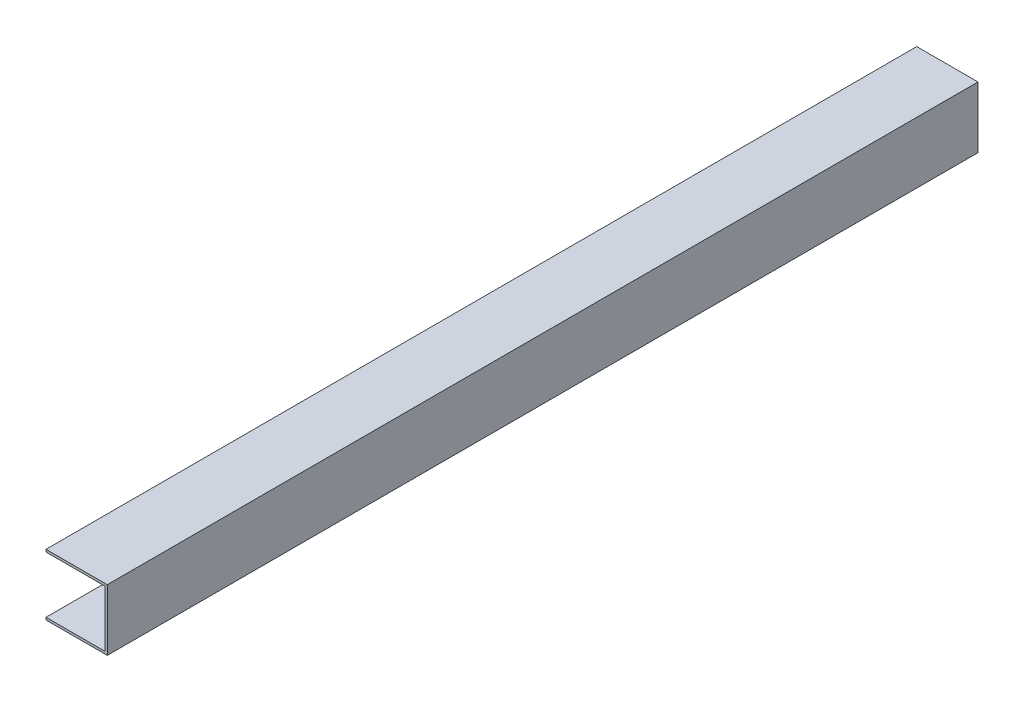
ISO-10303-21;
HEADER;
FILE_DESCRIPTION(('STEP AP214'),'2;1');
FILE_NAME('part.step','',(''),(''),'','','');
FILE_SCHEMA(('AUTOMOTIVE_DESIGN { 1 0 10303 214 1 1 1 1 }'));
ENDSEC;
DATA;
#1=APPLICATION_CONTEXT('core data for automotive mechanical design processes');
#2=APPLICATION_PROTOCOL_DEFINITION('international standard','automotive_design',2000,#1);
#3=PRODUCT_CONTEXT('',#1,'mechanical');
#4=PRODUCT('Part','Part','',(#3));
#5=PRODUCT_RELATED_PRODUCT_CATEGORY('part','',(#4));
#6=PRODUCT_DEFINITION_FORMATION('','',#4);
#7=PRODUCT_DEFINITION_CONTEXT('part definition',#1,'design');
#8=PRODUCT_DEFINITION('design','',#6,#7);
#9=PRODUCT_DEFINITION_SHAPE('','',#8);
#10=(LENGTH_UNIT() NAMED_UNIT(*) SI_UNIT(.MILLI.,.METRE.));
#11=(NAMED_UNIT(*) PLANE_ANGLE_UNIT() SI_UNIT($,.RADIAN.));
#12=(NAMED_UNIT(*) SI_UNIT($,.STERADIAN.) SOLID_ANGLE_UNIT());
#13=UNCERTAINTY_MEASURE_WITH_UNIT(LENGTH_MEASURE(1.E-05),#10,'distance_accuracy_value','');
#14=(GEOMETRIC_REPRESENTATION_CONTEXT(3) GLOBAL_UNCERTAINTY_ASSIGNED_CONTEXT((#13)) GLOBAL_UNIT_ASSIGNED_CONTEXT((#10,
#11,#12)) REPRESENTATION_CONTEXT('',''));
#15=CARTESIAN_POINT('',(0.,0.,0.));
#16=DIRECTION('',(0.,0.,1.));
#17=DIRECTION('',(1.,0.,0.));
#18=AXIS2_PLACEMENT_3D('',#15,#16,#17);
#19=CARTESIAN_POINT('',(0.,0.,361.));
#20=DIRECTION('',(0.,0.,-1.));
#21=DIRECTION('',(-1.,0.,0.));
#22=AXIS2_PLACEMENT_3D('',#19,#20,#21);
#23=PLANE('',#22);
#24=DIRECTION('',(1.,0.,0.));
#25=VECTOR('',#24,1.);
#26=CARTESIAN_POINT('',(-1.,-24.4,361.));
#27=LINE('',#26,#25);
#28=CARTESIAN_POINT('',(-25.4,-24.4,361.));
#29=VERTEX_POINT('',#28);
#30=CARTESIAN_POINT('',(-1.,-24.4,361.));
#31=VERTEX_POINT('',#30);
#32=EDGE_CURVE('E223',#29,#31,#27,.T.);
#33=ORIENTED_EDGE('',*,*,#32,.F.);
#34=DIRECTION('',(0.,-1.,0.));
#35=VECTOR('',#34,1.);
#36=CARTESIAN_POINT('',(-25.4,0.,361.));
#37=LINE('',#36,#35);
#38=CARTESIAN_POINT('',(-25.4,-25.4,361.));
#39=VERTEX_POINT('',#38);
#40=EDGE_CURVE('E179',#29,#39,#37,.T.);
#41=ORIENTED_EDGE('',*,*,#40,.T.);
#42=DIRECTION('',(1.,0.,0.));
#43=VECTOR('',#42,1.);
#44=CARTESIAN_POINT('',(0.,-25.4,361.));
#45=LINE('',#44,#43);
#46=CARTESIAN_POINT('',(0.,-25.4,361.));
#47=VERTEX_POINT('',#46);
#48=EDGE_CURVE('E65',#39,#47,#45,.T.);
#49=ORIENTED_EDGE('',*,*,#48,.T.);
#50=DIRECTION('',(0.,1.,0.));
#51=VECTOR('',#50,1.);
#52=CARTESIAN_POINT('',(0.,0.,361.));
#53=LINE('',#52,#51);
#54=CARTESIAN_POINT('',(0.,0.,361.));
#55=VERTEX_POINT('',#54);
#56=EDGE_CURVE('E176',#47,#55,#53,.T.);
#57=ORIENTED_EDGE('',*,*,#56,.T.);
#58=DIRECTION('',(-1.,0.,0.));
#59=VECTOR('',#58,1.);
#60=CARTESIAN_POINT('',(0.,0.,361.));
#61=LINE('',#60,#59);
#62=CARTESIAN_POINT('',(-25.4,0.,361.));
#63=VERTEX_POINT('',#62);
#64=EDGE_CURVE('E93',#55,#63,#61,.T.);
#65=ORIENTED_EDGE('',*,*,#64,.T.);
#66=CARTESIAN_POINT('',(-25.4,-1.,361.));
#67=VERTEX_POINT('',#66);
#68=EDGE_CURVE('E180',#63,#67,#37,.T.);
#69=ORIENTED_EDGE('',*,*,#68,.T.);
#70=DIRECTION('',(-1.,0.,0.));
#71=VECTOR('',#70,1.);
#72=CARTESIAN_POINT('',(-1.,-1.,361.));
#73=LINE('',#72,#71);
#74=CARTESIAN_POINT('',(-1.,-1.,361.));
#75=VERTEX_POINT('',#74);
#76=EDGE_CURVE('E221',#75,#67,#73,.T.);
#77=ORIENTED_EDGE('',*,*,#76,.F.);
#78=DIRECTION('',(0.,1.,0.));
#79=VECTOR('',#78,1.);
#80=CARTESIAN_POINT('',(-1.,-1.,361.));
#81=LINE('',#80,#79);
#82=EDGE_CURVE('E219',#31,#75,#81,.T.);
#83=ORIENTED_EDGE('',*,*,#82,.F.);
#84=EDGE_LOOP('',(#33,#41,#49,#57,#65,#69,#77,#83));
#85=FACE_BOUND('',#84,.T.);
#86=ADVANCED_FACE('F41',(#85),#23,.F.);
#87=CARTESIAN_POINT('',(0.,0.,0.));
#88=DIRECTION('',(0.,0.,-1.));
#89=DIRECTION('',(-1.,0.,0.));
#90=AXIS2_PLACEMENT_3D('',#87,#88,#89);
#91=PLANE('',#90);
#92=DIRECTION('',(-1.,0.,0.));
#93=VECTOR('',#92,1.);
#94=CARTESIAN_POINT('',(-1.,-1.,0.));
#95=LINE('',#94,#93);
#96=CARTESIAN_POINT('',(-1.,-1.,0.));
#97=VERTEX_POINT('',#96);
#98=CARTESIAN_POINT('',(-25.4,-1.,0.));
#99=VERTEX_POINT('',#98);
#100=EDGE_CURVE('E205',#97,#99,#95,.T.);
#101=ORIENTED_EDGE('',*,*,#100,.T.);
#102=DIRECTION('',(0.,-1.,0.));
#103=VECTOR('',#102,1.);
#104=CARTESIAN_POINT('',(-25.4,0.,0.));
#105=LINE('',#104,#103);
#106=CARTESIAN_POINT('',(-25.4,0.,0.));
#107=VERTEX_POINT('',#106);
#108=EDGE_CURVE('E190',#107,#99,#105,.T.);
#109=ORIENTED_EDGE('',*,*,#108,.F.);
#110=DIRECTION('',(-1.,0.,0.));
#111=VECTOR('',#110,1.);
#112=CARTESIAN_POINT('',(0.,0.,0.));
#113=LINE('',#112,#111);
#114=CARTESIAN_POINT('',(0.,0.,0.));
#115=VERTEX_POINT('',#114);
#116=EDGE_CURVE('E187',#115,#107,#113,.T.);
#117=ORIENTED_EDGE('',*,*,#116,.F.);
#118=DIRECTION('',(0.,1.,0.));
#119=VECTOR('',#118,1.);
#120=CARTESIAN_POINT('',(0.,0.,0.));
#121=LINE('',#120,#119);
#122=CARTESIAN_POINT('',(0.,-25.4,0.));
#123=VERTEX_POINT('',#122);
#124=EDGE_CURVE('E170',#123,#115,#121,.T.);
#125=ORIENTED_EDGE('',*,*,#124,.F.);
#126=DIRECTION('',(1.,0.,0.));
#127=VECTOR('',#126,1.);
#128=CARTESIAN_POINT('',(0.,-25.4,0.));
#129=LINE('',#128,#127);
#130=CARTESIAN_POINT('',(-25.4,-25.4,0.));
#131=VERTEX_POINT('',#130);
#132=EDGE_CURVE('E86',#131,#123,#129,.T.);
#133=ORIENTED_EDGE('',*,*,#132,.F.);
#134=CARTESIAN_POINT('',(-25.4,-24.4,0.));
#135=VERTEX_POINT('',#134);
#136=EDGE_CURVE('E189',#135,#131,#105,.T.);
#137=ORIENTED_EDGE('',*,*,#136,.F.);
#138=DIRECTION('',(1.,0.,0.));
#139=VECTOR('',#138,1.);
#140=CARTESIAN_POINT('',(-1.,-24.4,0.));
#141=LINE('',#140,#139);
#142=CARTESIAN_POINT('',(-1.,-24.4,0.));
#143=VERTEX_POINT('',#142);
#144=EDGE_CURVE('E208',#135,#143,#141,.T.);
#145=ORIENTED_EDGE('',*,*,#144,.T.);
#146=DIRECTION('',(0.,1.,0.));
#147=VECTOR('',#146,1.);
#148=CARTESIAN_POINT('',(-1.,-1.,0.));
#149=LINE('',#148,#147);
#150=EDGE_CURVE('E56',#143,#97,#149,.T.);
#151=ORIENTED_EDGE('',*,*,#150,.T.);
#152=EDGE_LOOP('',(#101,#109,#117,#125,#133,#137,#145,#151));
#153=FACE_BOUND('',#152,.T.);
#154=ADVANCED_FACE('F203',(#153),#91,.T.);
#155=CARTESIAN_POINT('',(0.,0.,361.));
#156=DIRECTION('',(-1.,0.,0.));
#157=DIRECTION('',(0.,-1.,0.));
#158=AXIS2_PLACEMENT_3D('',#155,#156,#157);
#159=PLANE('',#158);
#160=ORIENTED_EDGE('',*,*,#124,.T.);
#161=DIRECTION('',(0.,0.,-1.));
#162=VECTOR('',#161,1.);
#163=CARTESIAN_POINT('',(0.,0.,361.));
#164=LINE('',#163,#162);
#165=EDGE_CURVE('E11',#55,#115,#164,.T.);
#166=ORIENTED_EDGE('',*,*,#165,.F.);
#167=ORIENTED_EDGE('',*,*,#56,.F.);
#168=DIRECTION('',(0.,0.,-1.));
#169=VECTOR('',#168,1.);
#170=CARTESIAN_POINT('',(0.,-25.4,361.));
#171=LINE('',#170,#169);
#172=EDGE_CURVE('E184',#47,#123,#171,.T.);
#173=ORIENTED_EDGE('',*,*,#172,.T.);
#174=EDGE_LOOP('',(#160,#166,#167,#173));
#175=FACE_BOUND('',#174,.T.);
#176=ADVANCED_FACE('F43',(#175),#159,.F.);
#177=CARTESIAN_POINT('',(0.,0.,361.));
#178=DIRECTION('',(0.,-1.,0.));
#179=DIRECTION('',(0.,0.,-1.));
#180=AXIS2_PLACEMENT_3D('',#177,#178,#179);
#181=PLANE('',#180);
#182=ORIENTED_EDGE('',*,*,#116,.T.);
#183=DIRECTION('',(0.,0.,-1.));
#184=VECTOR('',#183,1.);
#185=CARTESIAN_POINT('',(-25.4,0.,361.));
#186=LINE('',#185,#184);
#187=EDGE_CURVE('E49',#63,#107,#186,.T.);
#188=ORIENTED_EDGE('',*,*,#187,.F.);
#189=ORIENTED_EDGE('',*,*,#64,.F.);
#190=ORIENTED_EDGE('',*,*,#165,.T.);
#191=EDGE_LOOP('',(#182,#188,#189,#190));
#192=FACE_BOUND('',#191,.T.);
#193=ADVANCED_FACE('F273',(#192),#181,.F.);
#194=CARTESIAN_POINT('',(-25.4,0.,361.));
#195=DIRECTION('',(1.,0.,0.));
#196=DIRECTION('',(0.,1.,0.));
#197=AXIS2_PLACEMENT_3D('',#194,#195,#196);
#198=PLANE('',#197);
#199=DIRECTION('',(0.,1.,0.));
#200=VECTOR('',#199,1.);
#201=CARTESIAN_POINT('',(-25.4,-24.4,61.));
#202=LINE('',#201,#200);
#203=CARTESIAN_POINT('',(-25.4,-24.4,61.));
#204=VERTEX_POINT('',#203);
#205=CARTESIAN_POINT('',(-25.4,-1.,61.));
#206=VERTEX_POINT('',#205);
#207=EDGE_CURVE('E148',#204,#206,#202,.T.);
#208=ORIENTED_EDGE('',*,*,#207,.F.);
#209=DIRECTION('',(0.,0.,1.));
#210=VECTOR('',#209,1.);
#211=CARTESIAN_POINT('',(-25.4,-24.4,0.));
#212=LINE('',#211,#210);
#213=EDGE_CURVE('E152',#135,#204,#212,.T.);
#214=ORIENTED_EDGE('',*,*,#213,.F.);
#215=ORIENTED_EDGE('',*,*,#136,.T.);
#216=DIRECTION('',(0.,0.,-1.));
#217=VECTOR('',#216,1.);
#218=CARTESIAN_POINT('',(-25.4,-25.4,361.));
#219=LINE('',#218,#217);
#220=EDGE_CURVE('E195',#39,#131,#219,.T.);
#221=ORIENTED_EDGE('',*,*,#220,.F.);
#222=ORIENTED_EDGE('',*,*,#40,.F.);
#223=DIRECTION('',(0.,0.,1.));
#224=VECTOR('',#223,1.);
#225=CARTESIAN_POINT('',(-25.4,-24.4,361.));
#226=LINE('',#225,#224);
#227=CARTESIAN_POINT('',(-25.4,-24.4,311.));
#228=VERTEX_POINT('',#227);
#229=EDGE_CURVE('E242',#228,#29,#226,.T.);
#230=ORIENTED_EDGE('',*,*,#229,.F.);
#231=DIRECTION('',(0.,-1.,0.));
#232=VECTOR('',#231,1.);
#233=CARTESIAN_POINT('',(-25.4,-1.,311.));
#234=LINE('',#233,#232);
#235=CARTESIAN_POINT('',(-25.4,-1.,311.));
#236=VERTEX_POINT('',#235);
#237=EDGE_CURVE('E213',#236,#228,#234,.T.);
#238=ORIENTED_EDGE('',*,*,#237,.F.);
#239=DIRECTION('',(0.,0.,-1.));
#240=VECTOR('',#239,1.);
#241=CARTESIAN_POINT('',(-25.4,-1.,361.));
#242=LINE('',#241,#240);
#243=EDGE_CURVE('E211',#67,#236,#242,.T.);
#244=ORIENTED_EDGE('',*,*,#243,.F.);
#245=ORIENTED_EDGE('',*,*,#68,.F.);
#246=ORIENTED_EDGE('',*,*,#187,.T.);
#247=ORIENTED_EDGE('',*,*,#108,.T.);
#248=DIRECTION('',(0.,0.,-1.));
#249=VECTOR('',#248,1.);
#250=CARTESIAN_POINT('',(-25.4,-1.,0.));
#251=LINE('',#250,#249);
#252=EDGE_CURVE('E210',#206,#99,#251,.T.);
#253=ORIENTED_EDGE('',*,*,#252,.F.);
#254=EDGE_LOOP('',(#208,#214,#215,#221,#222,#230,#238,#244,#245,#246,#247,#253));
#255=FACE_BOUND('',#254,.T.);
#256=ADVANCED_FACE('F200',(#255),#198,.F.);
#257=CARTESIAN_POINT('',(0.,-25.4,361.));
#258=DIRECTION('',(0.,1.,0.));
#259=DIRECTION('',(-1.,0.,0.));
#260=AXIS2_PLACEMENT_3D('',#257,#258,#259);
#261=PLANE('',#260);
#262=ORIENTED_EDGE('',*,*,#132,.T.);
#263=ORIENTED_EDGE('',*,*,#172,.F.);
#264=ORIENTED_EDGE('',*,*,#48,.F.);
#265=ORIENTED_EDGE('',*,*,#220,.T.);
#266=EDGE_LOOP('',(#262,#263,#264,#265));
#267=FACE_BOUND('',#266,.T.);
#268=ADVANCED_FACE('F234',(#267),#261,.F.);
#269=CARTESIAN_POINT('',(-1.,-1.,361.));
#270=DIRECTION('',(-1.,0.,0.));
#271=DIRECTION('',(0.,0.,1.));
#272=AXIS2_PLACEMENT_3D('',#269,#270,#271);
#273=PLANE('',#272);
#274=ORIENTED_EDGE('',*,*,#150,.F.);
#275=DIRECTION('',(0.,0.,-1.));
#276=VECTOR('',#275,1.);
#277=CARTESIAN_POINT('',(-1.,-24.4,361.));
#278=LINE('',#277,#276);
#279=EDGE_CURVE('E172',#31,#143,#278,.T.);
#280=ORIENTED_EDGE('',*,*,#279,.F.);
#281=ORIENTED_EDGE('',*,*,#82,.T.);
#282=DIRECTION('',(0.,0.,-1.));
#283=VECTOR('',#282,1.);
#284=CARTESIAN_POINT('',(-1.,-1.,361.));
#285=LINE('',#284,#283);
#286=EDGE_CURVE('E168',#75,#97,#285,.T.);
#287=ORIENTED_EDGE('',*,*,#286,.T.);
#288=EDGE_LOOP('',(#274,#280,#281,#287));
#289=FACE_BOUND('',#288,.T.);
#290=ADVANCED_FACE('F267',(#289),#273,.T.);
#291=CARTESIAN_POINT('',(-1.,-1.,361.));
#292=DIRECTION('',(0.,-1.,0.));
#293=DIRECTION('',(0.,0.,-1.));
#294=AXIS2_PLACEMENT_3D('',#291,#292,#293);
#295=PLANE('',#294);
#296=ORIENTED_EDGE('',*,*,#100,.F.);
#297=ORIENTED_EDGE('',*,*,#286,.F.);
#298=ORIENTED_EDGE('',*,*,#76,.T.);
#299=ORIENTED_EDGE('',*,*,#243,.T.);
#300=DIRECTION('',(-1.,0.,0.));
#301=VECTOR('',#300,1.);
#302=CARTESIAN_POINT('',(30.8047099439894,-0.999999999999993,311.));
#303=LINE('',#302,#301);
#304=CARTESIAN_POINT('',(-24.4,-0.999999999999993,311.));
#305=VERTEX_POINT('',#304);
#306=EDGE_CURVE('E167',#305,#236,#303,.T.);
#307=ORIENTED_EDGE('',*,*,#306,.F.);
#308=DIRECTION('',(0.,0.,-1.));
#309=VECTOR('',#308,1.);
#310=CARTESIAN_POINT('',(-24.4,-1.,361.));
#311=LINE('',#310,#309);
#312=CARTESIAN_POINT('',(-24.4,-1.,61.));
#313=VERTEX_POINT('',#312);
#314=EDGE_CURVE('E160',#305,#313,#311,.T.);
#315=ORIENTED_EDGE('',*,*,#314,.T.);
#316=DIRECTION('',(-1.,0.,0.));
#317=VECTOR('',#316,1.);
#318=CARTESIAN_POINT('',(0.00100000000000447,-0.999999999999997,61.));
#319=LINE('',#318,#317);
#320=EDGE_CURVE('E141',#313,#206,#319,.T.);
#321=ORIENTED_EDGE('',*,*,#320,.T.);
#322=ORIENTED_EDGE('',*,*,#252,.T.);
#323=EDGE_LOOP('',(#296,#297,#298,#299,#307,#315,#321,#322));
#324=FACE_BOUND('',#323,.T.);
#325=ADVANCED_FACE('F165',(#324),#295,.T.);
#326=CARTESIAN_POINT('',(-24.4,-1.,361.));
#327=DIRECTION('',(1.,0.,0.));
#328=DIRECTION('',(0.,0.,-1.));
#329=AXIS2_PLACEMENT_3D('',#326,#327,#328);
#330=PLANE('',#329);
#331=DIRECTION('',(0.,1.,0.));
#332=VECTOR('',#331,1.);
#333=CARTESIAN_POINT('',(-24.4,-24.4,61.));
#334=LINE('',#333,#332);
#335=CARTESIAN_POINT('',(-24.4,-24.4,61.));
#336=VERTEX_POINT('',#335);
#337=EDGE_CURVE('E145',#336,#313,#334,.T.);
#338=ORIENTED_EDGE('',*,*,#337,.T.);
#339=ORIENTED_EDGE('',*,*,#314,.F.);
#340=DIRECTION('',(0.,-1.,0.));
#341=VECTOR('',#340,1.);
#342=CARTESIAN_POINT('',(-24.4,-0.999999999999993,311.));
#343=LINE('',#342,#341);
#344=CARTESIAN_POINT('',(-24.4,-24.4,311.));
#345=VERTEX_POINT('',#344);
#346=EDGE_CURVE('E245',#305,#345,#343,.T.);
#347=ORIENTED_EDGE('',*,*,#346,.T.);
#348=DIRECTION('',(0.,0.,-1.));
#349=VECTOR('',#348,1.);
#350=CARTESIAN_POINT('',(-24.4,-24.4,361.));
#351=LINE('',#350,#349);
#352=EDGE_CURVE('E162',#345,#336,#351,.T.);
#353=ORIENTED_EDGE('',*,*,#352,.T.);
#354=EDGE_LOOP('',(#338,#339,#347,#353));
#355=FACE_BOUND('',#354,.T.);
#356=ADVANCED_FACE('F158',(#355),#330,.T.);
#357=CARTESIAN_POINT('',(-1.,-24.4,361.));
#358=DIRECTION('',(0.,1.,0.));
#359=DIRECTION('',(-1.,0.,0.));
#360=AXIS2_PLACEMENT_3D('',#357,#358,#359);
#361=PLANE('',#360);
#362=ORIENTED_EDGE('',*,*,#144,.F.);
#363=ORIENTED_EDGE('',*,*,#213,.T.);
#364=DIRECTION('',(-1.,0.,0.));
#365=VECTOR('',#364,1.);
#366=CARTESIAN_POINT('',(0.00100000000000794,-24.4,61.));
#367=LINE('',#366,#365);
#368=EDGE_CURVE('E153',#336,#204,#367,.T.);
#369=ORIENTED_EDGE('',*,*,#368,.F.);
#370=ORIENTED_EDGE('',*,*,#352,.F.);
#371=DIRECTION('',(-1.,0.,0.));
#372=VECTOR('',#371,1.);
#373=CARTESIAN_POINT('',(30.8047099439894,-24.4,311.));
#374=LINE('',#373,#372);
#375=EDGE_CURVE('E249',#345,#228,#374,.T.);
#376=ORIENTED_EDGE('',*,*,#375,.T.);
#377=ORIENTED_EDGE('',*,*,#229,.T.);
#378=ORIENTED_EDGE('',*,*,#32,.T.);
#379=ORIENTED_EDGE('',*,*,#279,.T.);
#380=EDGE_LOOP('',(#362,#363,#369,#370,#376,#377,#378,#379));
#381=FACE_BOUND('',#380,.T.);
#382=ADVANCED_FACE('F227',(#381),#361,.T.);
#383=CARTESIAN_POINT('',(30.8047099439894,-0.999999999999993,311.));
#384=DIRECTION('',(0.,0.,-1.));
#385=DIRECTION('',(-1.,0.,0.));
#386=AXIS2_PLACEMENT_3D('',#383,#384,#385);
#387=PLANE('',#386);
#388=ORIENTED_EDGE('',*,*,#306,.T.);
#389=ORIENTED_EDGE('',*,*,#237,.T.);
#390=ORIENTED_EDGE('',*,*,#375,.F.);
#391=ORIENTED_EDGE('',*,*,#346,.F.);
#392=EDGE_LOOP('',(#388,#389,#390,#391));
#393=FACE_BOUND('',#392,.T.);
#394=ADVANCED_FACE('F250',(#393),#387,.F.);
#395=CARTESIAN_POINT('',(0.00100000000000794,-24.4,61.));
#396=DIRECTION('',(0.,0.,1.));
#397=DIRECTION('',(1.,0.,0.));
#398=AXIS2_PLACEMENT_3D('',#395,#396,#397);
#399=PLANE('',#398);
#400=ORIENTED_EDGE('',*,*,#368,.T.);
#401=ORIENTED_EDGE('',*,*,#207,.T.);
#402=ORIENTED_EDGE('',*,*,#320,.F.);
#403=ORIENTED_EDGE('',*,*,#337,.F.);
#404=EDGE_LOOP('',(#400,#401,#402,#403));
#405=FACE_BOUND('',#404,.T.);
#406=ADVANCED_FACE('F144',(#405),#399,.F.);
#407=CLOSED_SHELL('',(#86,#154,#176,#193,#256,#268,#290,#325,#356,#382,#394,#406));
#408=MANIFOLD_SOLID_BREP('B2',#407);
#409=ADVANCED_BREP_SHAPE_REPRESENTATION('',(#18,#408),#14);
#410=SHAPE_DEFINITION_REPRESENTATION(#9,#409);
ENDSEC;
END-ISO-10303-21;
